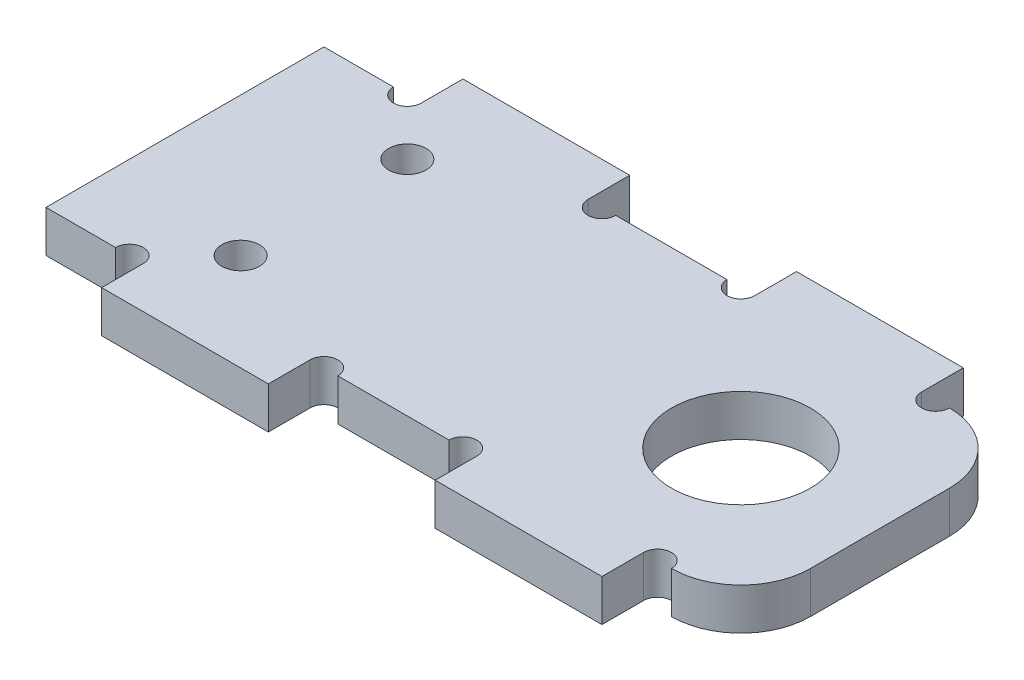
ISO-10303-21;
HEADER;
FILE_DESCRIPTION(('STEP AP214'),'2;1');
FILE_NAME('part.step','',(''),(''),'','','');
FILE_SCHEMA(('AUTOMOTIVE_DESIGN { 1 0 10303 214 1 1 1 1 }'));
ENDSEC;
DATA;
#1=APPLICATION_CONTEXT('core data for automotive mechanical design processes');
#2=APPLICATION_PROTOCOL_DEFINITION('international standard','automotive_design',2000,#1);
#3=PRODUCT_CONTEXT('',#1,'mechanical');
#4=PRODUCT('Part','Part','',(#3));
#5=PRODUCT_RELATED_PRODUCT_CATEGORY('part','',(#4));
#6=PRODUCT_DEFINITION_FORMATION('','',#4);
#7=PRODUCT_DEFINITION_CONTEXT('part definition',#1,'design');
#8=PRODUCT_DEFINITION('design','',#6,#7);
#9=PRODUCT_DEFINITION_SHAPE('','',#8);
#10=(LENGTH_UNIT() NAMED_UNIT(*) SI_UNIT(.MILLI.,.METRE.));
#11=(NAMED_UNIT(*) PLANE_ANGLE_UNIT() SI_UNIT($,.RADIAN.));
#12=(NAMED_UNIT(*) SI_UNIT($,.STERADIAN.) SOLID_ANGLE_UNIT());
#13=UNCERTAINTY_MEASURE_WITH_UNIT(LENGTH_MEASURE(1.E-05),#10,'distance_accuracy_value','');
#14=(GEOMETRIC_REPRESENTATION_CONTEXT(3) GLOBAL_UNCERTAINTY_ASSIGNED_CONTEXT((#13)) GLOBAL_UNIT_ASSIGNED_CONTEXT((#10,
#11,#12)) REPRESENTATION_CONTEXT('',''));
#15=CARTESIAN_POINT('',(0.,0.,0.));
#16=DIRECTION('',(0.,0.,1.));
#17=DIRECTION('',(1.,0.,0.));
#18=AXIS2_PLACEMENT_3D('',#15,#16,#17);
#19=CARTESIAN_POINT('',(-30.,3.,10.));
#20=DIRECTION('',(0.,0.,-1.));
#21=DIRECTION('',(1.,0.,0.));
#22=AXIS2_PLACEMENT_3D('',#19,#20,#21);
#23=PLANE('',#22);
#24=DIRECTION('',(-1.,0.,0.));
#25=VECTOR('',#24,1.);
#26=CARTESIAN_POINT('',(-10.,3.,10.));
#27=LINE('',#26,#25);
#28=CARTESIAN_POINT('',(-35.,3.,10.));
#29=VERTEX_POINT('',#28);
#30=CARTESIAN_POINT('',(-40.,3.,10.));
#31=VERTEX_POINT('',#30);
#32=EDGE_CURVE('E448',#29,#31,#27,.T.);
#33=ORIENTED_EDGE('',*,*,#32,.T.);
#34=DIRECTION('',(0.,-1.,0.));
#35=VECTOR('',#34,1.);
#36=CARTESIAN_POINT('',(-40.,3.,10.));
#37=LINE('',#36,#35);
#38=CARTESIAN_POINT('',(-40.,0.,10.));
#39=VERTEX_POINT('',#38);
#40=EDGE_CURVE('E268',#31,#39,#37,.T.);
#41=ORIENTED_EDGE('',*,*,#40,.T.);
#42=DIRECTION('',(-1.,0.,0.));
#43=VECTOR('',#42,1.);
#44=CARTESIAN_POINT('',(-30.,0.,10.));
#45=LINE('',#44,#43);
#46=CARTESIAN_POINT('',(-35.,0.,10.));
#47=VERTEX_POINT('',#46);
#48=EDGE_CURVE('E252',#47,#39,#45,.T.);
#49=ORIENTED_EDGE('',*,*,#48,.F.);
#50=DIRECTION('',(0.,-1.,0.));
#51=VECTOR('',#50,1.);
#52=CARTESIAN_POINT('',(-35.,3.,10.));
#53=LINE('',#52,#51);
#54=EDGE_CURVE('E233',#29,#47,#53,.T.);
#55=ORIENTED_EDGE('',*,*,#54,.F.);
#56=EDGE_LOOP('',(#33,#41,#49,#55));
#57=FACE_BOUND('',#56,.T.);
#58=ADVANCED_FACE('F37',(#57),#23,.F.);
#59=CARTESIAN_POINT('',(-10.,3.,-10.));
#60=DIRECTION('',(0.,0.,1.));
#61=DIRECTION('',(-1.,0.,0.));
#62=AXIS2_PLACEMENT_3D('',#59,#60,#61);
#63=PLANE('',#62);
#64=DIRECTION('',(1.,0.,0.));
#65=VECTOR('',#64,1.);
#66=CARTESIAN_POINT('',(-10.,0.,-10.));
#67=LINE('',#66,#65);
#68=CARTESIAN_POINT('',(-40.,0.,-10.));
#69=VERTEX_POINT('',#68);
#70=CARTESIAN_POINT('',(-35.,0.,-10.));
#71=VERTEX_POINT('',#70);
#72=EDGE_CURVE('E261',#69,#71,#67,.T.);
#73=ORIENTED_EDGE('',*,*,#72,.F.);
#74=DIRECTION('',(0.,-1.,0.));
#75=VECTOR('',#74,1.);
#76=CARTESIAN_POINT('',(-40.,3.,-10.));
#77=LINE('',#76,#75);
#78=CARTESIAN_POINT('',(-40.,3.,-10.));
#79=VERTEX_POINT('',#78);
#80=EDGE_CURVE('E265',#79,#69,#77,.T.);
#81=ORIENTED_EDGE('',*,*,#80,.F.);
#82=DIRECTION('',(1.,0.,0.));
#83=VECTOR('',#82,1.);
#84=CARTESIAN_POINT('',(-40.,3.,-10.));
#85=LINE('',#84,#83);
#86=CARTESIAN_POINT('',(-35.,3.,-10.));
#87=VERTEX_POINT('',#86);
#88=EDGE_CURVE('E269',#79,#87,#85,.T.);
#89=ORIENTED_EDGE('',*,*,#88,.T.);
#90=DIRECTION('',(0.,-1.,0.));
#91=VECTOR('',#90,1.);
#92=CARTESIAN_POINT('',(-35.,3.,-10.));
#93=LINE('',#92,#91);
#94=EDGE_CURVE('E330',#71,#87,#93,.F.);
#95=ORIENTED_EDGE('',*,*,#94,.F.);
#96=EDGE_LOOP('',(#73,#81,#89,#95));
#97=FACE_BOUND('',#96,.T.);
#98=ADVANCED_FACE('F536',(#97),#63,.F.);
#99=CARTESIAN_POINT('',(0.,3.,0.));
#100=DIRECTION('',(0.,-1.,0.));
#101=DIRECTION('',(0.,0.,1.));
#102=AXIS2_PLACEMENT_3D('',#99,#100,#101);
#103=PLANE('',#102);
#104=DIRECTION('',(0.,0.,1.));
#105=VECTOR('',#104,1.);
#106=CARTESIAN_POINT('',(-21.,3.,-10.));
#107=LINE('',#106,#105);
#108=CARTESIAN_POINT('',(-21.,3.,-13.));
#109=VERTEX_POINT('',#108);
#110=CARTESIAN_POINT('',(-21.,3.,-10.));
#111=VERTEX_POINT('',#110);
#112=EDGE_CURVE('E404',#109,#111,#107,.T.);
#113=ORIENTED_EDGE('',*,*,#112,.F.);
#114=DIRECTION('',(1.,0.,0.));
#115=VECTOR('',#114,1.);
#116=CARTESIAN_POINT('',(-33.,3.,-13.));
#117=LINE('',#116,#115);
#118=CARTESIAN_POINT('',(-33.,3.,-13.));
#119=VERTEX_POINT('',#118);
#120=EDGE_CURVE('E407',#119,#109,#117,.T.);
#121=ORIENTED_EDGE('',*,*,#120,.F.);
#122=DIRECTION('',(0.,0.,-1.));
#123=VECTOR('',#122,1.);
#124=CARTESIAN_POINT('',(-33.,3.,-10.));
#125=LINE('',#124,#123);
#126=CARTESIAN_POINT('',(-33.,3.,-10.));
#127=VERTEX_POINT('',#126);
#128=EDGE_CURVE('E411',#127,#119,#125,.T.);
#129=ORIENTED_EDGE('',*,*,#128,.F.);
#130=CARTESIAN_POINT('',(-34.,3.,-10.));
#131=DIRECTION('',(0.,1.,0.));
#132=DIRECTION('',(0.,0.,1.));
#133=AXIS2_PLACEMENT_3D('',#130,#131,#132);
#134=CIRCLE('',#133,0.999999999999998);
#135=EDGE_CURVE('E234',#87,#127,#134,.T.);
#136=ORIENTED_EDGE('',*,*,#135,.F.);
#137=ORIENTED_EDGE('',*,*,#88,.F.);
#138=DIRECTION('',(0.,0.,-1.));
#139=VECTOR('',#138,1.);
#140=CARTESIAN_POINT('',(-40.,3.,10.));
#141=LINE('',#140,#139);
#142=EDGE_CURVE('E451',#31,#79,#141,.T.);
#143=ORIENTED_EDGE('',*,*,#142,.F.);
#144=ORIENTED_EDGE('',*,*,#32,.F.);
#145=CARTESIAN_POINT('',(-34.,3.,10.));
#146=DIRECTION('',(0.,1.,0.));
#147=DIRECTION('',(0.,0.,-1.));
#148=AXIS2_PLACEMENT_3D('',#145,#146,#147);
#149=CIRCLE('',#148,0.999999999999998);
#150=CARTESIAN_POINT('',(-33.,3.,10.));
#151=VERTEX_POINT('',#150);
#152=EDGE_CURVE('E244',#151,#29,#149,.T.);
#153=ORIENTED_EDGE('',*,*,#152,.F.);
#154=DIRECTION('',(0.,0.,-1.));
#155=VECTOR('',#154,1.);
#156=CARTESIAN_POINT('',(-33.,3.,10.));
#157=LINE('',#156,#155);
#158=CARTESIAN_POINT('',(-33.,3.,13.));
#159=VERTEX_POINT('',#158);
#160=EDGE_CURVE('E337',#159,#151,#157,.T.);
#161=ORIENTED_EDGE('',*,*,#160,.F.);
#162=DIRECTION('',(-1.,0.,0.));
#163=VECTOR('',#162,1.);
#164=CARTESIAN_POINT('',(-33.,3.,13.));
#165=LINE('',#164,#163);
#166=CARTESIAN_POINT('',(-21.,3.,13.));
#167=VERTEX_POINT('',#166);
#168=EDGE_CURVE('E339',#167,#159,#165,.T.);
#169=ORIENTED_EDGE('',*,*,#168,.F.);
#170=DIRECTION('',(0.,0.,1.));
#171=VECTOR('',#170,1.);
#172=CARTESIAN_POINT('',(-21.,3.,10.));
#173=LINE('',#172,#171);
#174=CARTESIAN_POINT('',(-21.,3.,10.));
#175=VERTEX_POINT('',#174);
#176=EDGE_CURVE('E334',#175,#167,#173,.T.);
#177=ORIENTED_EDGE('',*,*,#176,.F.);
#178=CARTESIAN_POINT('',(-20.,3.,10.));
#179=DIRECTION('',(0.,1.,0.));
#180=DIRECTION('',(0.,0.,1.));
#181=AXIS2_PLACEMENT_3D('',#178,#179,#180);
#182=CIRCLE('',#181,1.00000000000001);
#183=CARTESIAN_POINT('',(-19.,3.,10.));
#184=VERTEX_POINT('',#183);
#185=EDGE_CURVE('E243',#184,#175,#182,.T.);
#186=ORIENTED_EDGE('',*,*,#185,.F.);
#187=CARTESIAN_POINT('',(-11.,3.,10.));
#188=VERTEX_POINT('',#187);
#189=EDGE_CURVE('E229',#188,#184,#27,.T.);
#190=ORIENTED_EDGE('',*,*,#189,.F.);
#191=CARTESIAN_POINT('',(-10.,3.,10.));
#192=DIRECTION('',(0.,1.,0.));
#193=DIRECTION('',(0.,0.,-1.));
#194=AXIS2_PLACEMENT_3D('',#191,#192,#193);
#195=CIRCLE('',#194,1.00000000000001);
#196=CARTESIAN_POINT('',(-9.,3.,10.));
#197=VERTEX_POINT('',#196);
#198=EDGE_CURVE('E312',#197,#188,#195,.T.);
#199=ORIENTED_EDGE('',*,*,#198,.F.);
#200=DIRECTION('',(0.,0.,-1.));
#201=VECTOR('',#200,1.);
#202=CARTESIAN_POINT('',(-9.,3.,10.));
#203=LINE('',#202,#201);
#204=CARTESIAN_POINT('',(-9.,3.,13.));
#205=VERTEX_POINT('',#204);
#206=EDGE_CURVE('E361',#205,#197,#203,.T.);
#207=ORIENTED_EDGE('',*,*,#206,.F.);
#208=DIRECTION('',(-1.,0.,0.));
#209=VECTOR('',#208,1.);
#210=CARTESIAN_POINT('',(3.,3.,13.));
#211=LINE('',#210,#209);
#212=CARTESIAN_POINT('',(3.,3.,13.));
#213=VERTEX_POINT('',#212);
#214=EDGE_CURVE('E356',#213,#205,#211,.T.);
#215=ORIENTED_EDGE('',*,*,#214,.F.);
#216=DIRECTION('',(0.,0.,1.));
#217=VECTOR('',#216,1.);
#218=CARTESIAN_POINT('',(3.,3.,10.));
#219=LINE('',#218,#217);
#220=CARTESIAN_POINT('',(3.,3.,10.));
#221=VERTEX_POINT('',#220);
#222=EDGE_CURVE('E303',#221,#213,#219,.T.);
#223=ORIENTED_EDGE('',*,*,#222,.F.);
#224=CARTESIAN_POINT('',(4.,3.,10.));
#225=DIRECTION('',(0.,1.,0.));
#226=DIRECTION('',(0.,0.,1.));
#227=AXIS2_PLACEMENT_3D('',#224,#225,#226);
#228=CIRCLE('',#227,1.);
#229=CARTESIAN_POINT('',(5.,3.,10.));
#230=VERTEX_POINT('',#229);
#231=EDGE_CURVE('E297',#230,#221,#228,.T.);
#232=ORIENTED_EDGE('',*,*,#231,.F.);
#233=CARTESIAN_POINT('',(5.,3.,5.));
#234=DIRECTION('',(0.,1.,0.));
#235=DIRECTION('',(0.,0.,1.));
#236=AXIS2_PLACEMENT_3D('',#233,#234,#235);
#237=CIRCLE('',#236,5.);
#238=CARTESIAN_POINT('',(10.,3.,5.));
#239=VERTEX_POINT('',#238);
#240=EDGE_CURVE('E45',#239,#230,#237,.F.);
#241=ORIENTED_EDGE('',*,*,#240,.F.);
#242=DIRECTION('',(0.,0.,1.));
#243=VECTOR('',#242,1.);
#244=CARTESIAN_POINT('',(10.,3.,-10.));
#245=LINE('',#244,#243);
#246=CARTESIAN_POINT('',(10.,3.,-5.));
#247=VERTEX_POINT('',#246);
#248=EDGE_CURVE('E264',#247,#239,#245,.T.);
#249=ORIENTED_EDGE('',*,*,#248,.F.);
#250=CARTESIAN_POINT('',(5.,3.,-5.));
#251=DIRECTION('',(0.,1.,0.));
#252=DIRECTION('',(0.,0.,1.));
#253=AXIS2_PLACEMENT_3D('',#250,#251,#252);
#254=CIRCLE('',#253,5.);
#255=CARTESIAN_POINT('',(4.99999999999999,3.,-10.));
#256=VERTEX_POINT('',#255);
#257=EDGE_CURVE('E284',#256,#247,#254,.F.);
#258=ORIENTED_EDGE('',*,*,#257,.F.);
#259=CARTESIAN_POINT('',(3.99999999999999,3.,-10.));
#260=DIRECTION('',(0.,1.,0.));
#261=DIRECTION('',(0.,0.,-1.));
#262=AXIS2_PLACEMENT_3D('',#259,#260,#261);
#263=CIRCLE('',#262,1.);
#264=CARTESIAN_POINT('',(3.,3.,-10.));
#265=VERTEX_POINT('',#264);
#266=EDGE_CURVE('E309',#265,#256,#263,.T.);
#267=ORIENTED_EDGE('',*,*,#266,.F.);
#268=DIRECTION('',(0.,0.,1.));
#269=VECTOR('',#268,1.);
#270=CARTESIAN_POINT('',(3.,3.,-10.));
#271=LINE('',#270,#269);
#272=CARTESIAN_POINT('',(3.,3.,-13.));
#273=VERTEX_POINT('',#272);
#274=EDGE_CURVE('E381',#273,#265,#271,.T.);
#275=ORIENTED_EDGE('',*,*,#274,.F.);
#276=DIRECTION('',(1.,0.,0.));
#277=VECTOR('',#276,1.);
#278=CARTESIAN_POINT('',(3.,3.,-13.));
#279=LINE('',#278,#277);
#280=CARTESIAN_POINT('',(-9.,3.,-13.));
#281=VERTEX_POINT('',#280);
#282=EDGE_CURVE('E385',#281,#273,#279,.T.);
#283=ORIENTED_EDGE('',*,*,#282,.F.);
#284=DIRECTION('',(0.,0.,-1.));
#285=VECTOR('',#284,1.);
#286=CARTESIAN_POINT('',(-9.,3.,-10.));
#287=LINE('',#286,#285);
#288=CARTESIAN_POINT('',(-9.,3.,-10.));
#289=VERTEX_POINT('',#288);
#290=EDGE_CURVE('E378',#289,#281,#287,.T.);
#291=ORIENTED_EDGE('',*,*,#290,.F.);
#292=CARTESIAN_POINT('',(-10.,3.,-10.));
#293=DIRECTION('',(0.,1.,0.));
#294=DIRECTION('',(0.,0.,1.));
#295=AXIS2_PLACEMENT_3D('',#292,#293,#294);
#296=CIRCLE('',#295,1.);
#297=CARTESIAN_POINT('',(-11.,3.,-10.));
#298=VERTEX_POINT('',#297);
#299=EDGE_CURVE('E469',#298,#289,#296,.T.);
#300=ORIENTED_EDGE('',*,*,#299,.F.);
#301=CARTESIAN_POINT('',(-19.,3.,-10.));
#302=VERTEX_POINT('',#301);
#303=EDGE_CURVE('E452',#302,#298,#85,.T.);
#304=ORIENTED_EDGE('',*,*,#303,.F.);
#305=CARTESIAN_POINT('',(-20.,3.,-10.));
#306=DIRECTION('',(0.,1.,0.));
#307=DIRECTION('',(0.,0.,-1.));
#308=AXIS2_PLACEMENT_3D('',#305,#306,#307);
#309=CIRCLE('',#308,1.);
#310=EDGE_CURVE('E320',#111,#302,#309,.T.);
#311=ORIENTED_EDGE('',*,*,#310,.F.);
#312=EDGE_LOOP('',(#113,#121,#129,#136,#137,#143,#144,#153,#161,#169,#177,#186,#190,#199,#207,
#215,#223,#232,#241,#249,#258,#267,#275,#283,#291,#300,#304,#311));
#313=FACE_BOUND('',#312,.T.);
#314=CARTESIAN_POINT('',(0.,3.,0.));
#315=DIRECTION('',(0.,-1.,0.));
#316=DIRECTION('',(0.,0.,-1.));
#317=AXIS2_PLACEMENT_3D('',#314,#315,#316);
#318=CIRCLE('',#317,5.);
#319=CARTESIAN_POINT('',(0.,3.,-5.));
#320=VERTEX_POINT('',#319);
#321=EDGE_CURVE('E442',#320,#320,#318,.T.);
#322=ORIENTED_EDGE('',*,*,#321,.T.);
#323=EDGE_LOOP('',(#322));
#324=FACE_BOUND('',#323,.T.);
#325=CARTESIAN_POINT('',(-30.,3.,6.));
#326=DIRECTION('',(0.,-1.,0.));
#327=DIRECTION('',(0.,0.,1.));
#328=AXIS2_PLACEMENT_3D('',#325,#326,#327);
#329=CIRCLE('',#328,1.35);
#330=CARTESIAN_POINT('',(-30.,3.,7.35));
#331=VERTEX_POINT('',#330);
#332=EDGE_CURVE('E436',#331,#331,#329,.T.);
#333=ORIENTED_EDGE('',*,*,#332,.T.);
#334=EDGE_LOOP('',(#333));
#335=FACE_BOUND('',#334,.T.);
#336=CARTESIAN_POINT('',(-30.,3.,-6.));
#337=DIRECTION('',(0.,-1.,0.));
#338=DIRECTION('',(0.,0.,-1.));
#339=AXIS2_PLACEMENT_3D('',#336,#337,#338);
#340=CIRCLE('',#339,1.35);
#341=CARTESIAN_POINT('',(-30.,3.,-7.35));
#342=VERTEX_POINT('',#341);
#343=EDGE_CURVE('E430',#342,#342,#340,.T.);
#344=ORIENTED_EDGE('',*,*,#343,.T.);
#345=EDGE_LOOP('',(#344));
#346=FACE_BOUND('',#345,.T.);
#347=ADVANCED_FACE('F299',(#313,#324,#335,#346),#103,.F.);
#348=CARTESIAN_POINT('',(0.,0.,0.));
#349=DIRECTION('',(0.,-1.,0.));
#350=DIRECTION('',(0.,0.,1.));
#351=AXIS2_PLACEMENT_3D('',#348,#349,#350);
#352=PLANE('',#351);
#353=CARTESIAN_POINT('',(-20.,0.,-10.));
#354=DIRECTION('',(0.,1.,0.));
#355=DIRECTION('',(0.,0.,-1.));
#356=AXIS2_PLACEMENT_3D('',#353,#354,#355);
#357=CIRCLE('',#356,1.);
#358=CARTESIAN_POINT('',(-21.,0.,-10.));
#359=VERTEX_POINT('',#358);
#360=CARTESIAN_POINT('',(-19.,0.,-10.));
#361=VERTEX_POINT('',#360);
#362=EDGE_CURVE('E472',#359,#361,#357,.T.);
#363=ORIENTED_EDGE('',*,*,#362,.T.);
#364=CARTESIAN_POINT('',(-11.,0.,-10.));
#365=VERTEX_POINT('',#364);
#366=EDGE_CURVE('E254',#361,#365,#67,.T.);
#367=ORIENTED_EDGE('',*,*,#366,.T.);
#368=CARTESIAN_POINT('',(-10.,0.,-10.));
#369=DIRECTION('',(0.,1.,0.));
#370=DIRECTION('',(0.,0.,1.));
#371=AXIS2_PLACEMENT_3D('',#368,#369,#370);
#372=CIRCLE('',#371,1.);
#373=CARTESIAN_POINT('',(-9.,0.,-10.));
#374=VERTEX_POINT('',#373);
#375=EDGE_CURVE('E473',#365,#374,#372,.T.);
#376=ORIENTED_EDGE('',*,*,#375,.T.);
#377=DIRECTION('',(0.,0.,1.));
#378=VECTOR('',#377,1.);
#379=CARTESIAN_POINT('',(-9.,0.,-10.));
#380=LINE('',#379,#378);
#381=CARTESIAN_POINT('',(-9.,0.,-13.));
#382=VERTEX_POINT('',#381);
#383=EDGE_CURVE('E391',#382,#374,#380,.T.);
#384=ORIENTED_EDGE('',*,*,#383,.F.);
#385=DIRECTION('',(-1.,0.,0.));
#386=VECTOR('',#385,1.);
#387=CARTESIAN_POINT('',(3.,0.,-13.));
#388=LINE('',#387,#386);
#389=CARTESIAN_POINT('',(3.,0.,-13.));
#390=VERTEX_POINT('',#389);
#391=EDGE_CURVE('E388',#390,#382,#388,.T.);
#392=ORIENTED_EDGE('',*,*,#391,.F.);
#393=DIRECTION('',(0.,0.,-1.));
#394=VECTOR('',#393,1.);
#395=CARTESIAN_POINT('',(3.,0.,-10.));
#396=LINE('',#395,#394);
#397=CARTESIAN_POINT('',(3.,0.,-10.));
#398=VERTEX_POINT('',#397);
#399=EDGE_CURVE('E377',#398,#390,#396,.T.);
#400=ORIENTED_EDGE('',*,*,#399,.F.);
#401=CARTESIAN_POINT('',(3.99999999999999,0.,-10.));
#402=DIRECTION('',(0.,1.,0.));
#403=DIRECTION('',(0.,0.,-1.));
#404=AXIS2_PLACEMENT_3D('',#401,#402,#403);
#405=CIRCLE('',#404,1.);
#406=CARTESIAN_POINT('',(4.99999999999999,0.,-10.));
#407=VERTEX_POINT('',#406);
#408=EDGE_CURVE('E305',#398,#407,#405,.T.);
#409=ORIENTED_EDGE('',*,*,#408,.T.);
#410=CARTESIAN_POINT('',(5.,0.,-5.));
#411=DIRECTION('',(0.,1.,0.));
#412=DIRECTION('',(0.,0.,1.));
#413=AXIS2_PLACEMENT_3D('',#410,#411,#412);
#414=CIRCLE('',#413,5.);
#415=CARTESIAN_POINT('',(10.,0.,-5.));
#416=VERTEX_POINT('',#415);
#417=EDGE_CURVE('E274',#416,#407,#414,.T.);
#418=ORIENTED_EDGE('',*,*,#417,.F.);
#419=DIRECTION('',(0.,0.,1.));
#420=VECTOR('',#419,1.);
#421=CARTESIAN_POINT('',(10.,0.,-10.));
#422=LINE('',#421,#420);
#423=CARTESIAN_POINT('',(10.,0.,5.));
#424=VERTEX_POINT('',#423);
#425=EDGE_CURVE('E257',#416,#424,#422,.T.);
#426=ORIENTED_EDGE('',*,*,#425,.T.);
#427=CARTESIAN_POINT('',(5.,0.,5.));
#428=DIRECTION('',(0.,1.,0.));
#429=DIRECTION('',(0.,0.,1.));
#430=AXIS2_PLACEMENT_3D('',#427,#428,#429);
#431=CIRCLE('',#430,5.);
#432=CARTESIAN_POINT('',(5.,0.,10.));
#433=VERTEX_POINT('',#432);
#434=EDGE_CURVE('E277',#433,#424,#431,.T.);
#435=ORIENTED_EDGE('',*,*,#434,.F.);
#436=CARTESIAN_POINT('',(4.,0.,10.));
#437=DIRECTION('',(0.,1.,0.));
#438=DIRECTION('',(0.,0.,1.));
#439=AXIS2_PLACEMENT_3D('',#436,#437,#438);
#440=CIRCLE('',#439,1.);
#441=CARTESIAN_POINT('',(3.,0.,10.));
#442=VERTEX_POINT('',#441);
#443=EDGE_CURVE('E306',#433,#442,#440,.T.);
#444=ORIENTED_EDGE('',*,*,#443,.T.);
#445=DIRECTION('',(0.,0.,-1.));
#446=VECTOR('',#445,1.);
#447=CARTESIAN_POINT('',(3.,0.,10.));
#448=LINE('',#447,#446);
#449=CARTESIAN_POINT('',(3.,0.,13.));
#450=VERTEX_POINT('',#449);
#451=EDGE_CURVE('E367',#450,#442,#448,.T.);
#452=ORIENTED_EDGE('',*,*,#451,.F.);
#453=DIRECTION('',(1.,0.,0.));
#454=VECTOR('',#453,1.);
#455=CARTESIAN_POINT('',(3.,0.,13.));
#456=LINE('',#455,#454);
#457=CARTESIAN_POINT('',(-9.,0.,13.));
#458=VERTEX_POINT('',#457);
#459=EDGE_CURVE('E364',#458,#450,#456,.T.);
#460=ORIENTED_EDGE('',*,*,#459,.F.);
#461=DIRECTION('',(0.,0.,1.));
#462=VECTOR('',#461,1.);
#463=CARTESIAN_POINT('',(-9.,0.,10.));
#464=LINE('',#463,#462);
#465=CARTESIAN_POINT('',(-9.,0.,10.));
#466=VERTEX_POINT('',#465);
#467=EDGE_CURVE('E355',#466,#458,#464,.T.);
#468=ORIENTED_EDGE('',*,*,#467,.F.);
#469=CARTESIAN_POINT('',(-10.,0.,10.));
#470=DIRECTION('',(0.,1.,0.));
#471=DIRECTION('',(0.,0.,-1.));
#472=AXIS2_PLACEMENT_3D('',#469,#470,#471);
#473=CIRCLE('',#472,1.00000000000001);
#474=CARTESIAN_POINT('',(-11.,0.,10.));
#475=VERTEX_POINT('',#474);
#476=EDGE_CURVE('E250',#466,#475,#473,.T.);
#477=ORIENTED_EDGE('',*,*,#476,.T.);
#478=CARTESIAN_POINT('',(-19.,0.,10.));
#479=VERTEX_POINT('',#478);
#480=EDGE_CURVE('E226',#475,#479,#45,.T.);
#481=ORIENTED_EDGE('',*,*,#480,.T.);
#482=CARTESIAN_POINT('',(-20.,0.,10.));
#483=DIRECTION('',(0.,1.,0.));
#484=DIRECTION('',(0.,0.,1.));
#485=AXIS2_PLACEMENT_3D('',#482,#483,#484);
#486=CIRCLE('',#485,1.00000000000001);
#487=CARTESIAN_POINT('',(-21.,0.,10.));
#488=VERTEX_POINT('',#487);
#489=EDGE_CURVE('E237',#479,#488,#486,.T.);
#490=ORIENTED_EDGE('',*,*,#489,.T.);
#491=DIRECTION('',(0.,0.,-1.));
#492=VECTOR('',#491,1.);
#493=CARTESIAN_POINT('',(-21.,0.,10.));
#494=LINE('',#493,#492);
#495=CARTESIAN_POINT('',(-21.,0.,13.));
#496=VERTEX_POINT('',#495);
#497=EDGE_CURVE('E345',#496,#488,#494,.T.);
#498=ORIENTED_EDGE('',*,*,#497,.F.);
#499=DIRECTION('',(1.,0.,0.));
#500=VECTOR('',#499,1.);
#501=CARTESIAN_POINT('',(-33.,0.,13.));
#502=LINE('',#501,#500);
#503=CARTESIAN_POINT('',(-33.,0.,13.));
#504=VERTEX_POINT('',#503);
#505=EDGE_CURVE('E342',#504,#496,#502,.T.);
#506=ORIENTED_EDGE('',*,*,#505,.F.);
#507=DIRECTION('',(0.,0.,1.));
#508=VECTOR('',#507,1.);
#509=CARTESIAN_POINT('',(-33.,0.,10.));
#510=LINE('',#509,#508);
#511=CARTESIAN_POINT('',(-33.,0.,10.));
#512=VERTEX_POINT('',#511);
#513=EDGE_CURVE('E333',#512,#504,#510,.T.);
#514=ORIENTED_EDGE('',*,*,#513,.F.);
#515=CARTESIAN_POINT('',(-34.,0.,10.));
#516=DIRECTION('',(0.,1.,0.));
#517=DIRECTION('',(0.,0.,-1.));
#518=AXIS2_PLACEMENT_3D('',#515,#516,#517);
#519=CIRCLE('',#518,0.999999999999998);
#520=EDGE_CURVE('E507',#512,#47,#519,.T.);
#521=ORIENTED_EDGE('',*,*,#520,.T.);
#522=ORIENTED_EDGE('',*,*,#48,.T.);
#523=DIRECTION('',(0.,0.,-1.));
#524=VECTOR('',#523,1.);
#525=CARTESIAN_POINT('',(-40.,0.,10.));
#526=LINE('',#525,#524);
#527=EDGE_CURVE('E251',#39,#69,#526,.T.);
#528=ORIENTED_EDGE('',*,*,#527,.T.);
#529=ORIENTED_EDGE('',*,*,#72,.T.);
#530=CARTESIAN_POINT('',(-34.,0.,-10.));
#531=DIRECTION('',(0.,1.,0.));
#532=DIRECTION('',(0.,0.,1.));
#533=AXIS2_PLACEMENT_3D('',#530,#531,#532);
#534=CIRCLE('',#533,0.999999999999998);
#535=CARTESIAN_POINT('',(-33.,0.,-10.));
#536=VERTEX_POINT('',#535);
#537=EDGE_CURVE('E318',#71,#536,#534,.T.);
#538=ORIENTED_EDGE('',*,*,#537,.T.);
#539=DIRECTION('',(0.,0.,1.));
#540=VECTOR('',#539,1.);
#541=CARTESIAN_POINT('',(-33.,0.,-10.));
#542=LINE('',#541,#540);
#543=CARTESIAN_POINT('',(-33.,0.,-13.));
#544=VERTEX_POINT('',#543);
#545=EDGE_CURVE('E403',#544,#536,#542,.T.);
#546=ORIENTED_EDGE('',*,*,#545,.F.);
#547=DIRECTION('',(-1.,0.,0.));
#548=VECTOR('',#547,1.);
#549=CARTESIAN_POINT('',(-33.,0.,-13.));
#550=LINE('',#549,#548);
#551=CARTESIAN_POINT('',(-21.,0.,-13.));
#552=VERTEX_POINT('',#551);
#553=EDGE_CURVE('E420',#552,#544,#550,.T.);
#554=ORIENTED_EDGE('',*,*,#553,.F.);
#555=DIRECTION('',(0.,0.,-1.));
#556=VECTOR('',#555,1.);
#557=CARTESIAN_POINT('',(-21.,0.,-10.));
#558=LINE('',#557,#556);
#559=EDGE_CURVE('E417',#359,#552,#558,.T.);
#560=ORIENTED_EDGE('',*,*,#559,.F.);
#561=EDGE_LOOP('',(#363,#367,#376,#384,#392,#400,#409,#418,#426,#435,#444,#452,#460,#468,#477,
#481,#490,#498,#506,#514,#521,#522,#528,#529,#538,#546,#554,#560));
#562=FACE_BOUND('',#561,.T.);
#563=CARTESIAN_POINT('',(-30.,0.,6.));
#564=DIRECTION('',(0.,-1.,0.));
#565=DIRECTION('',(0.,0.,1.));
#566=AXIS2_PLACEMENT_3D('',#563,#564,#565);
#567=CIRCLE('',#566,1.35);
#568=CARTESIAN_POINT('',(-30.,0.,7.35));
#569=VERTEX_POINT('',#568);
#570=EDGE_CURVE('E433',#569,#569,#567,.T.);
#571=ORIENTED_EDGE('',*,*,#570,.F.);
#572=EDGE_LOOP('',(#571));
#573=FACE_BOUND('',#572,.T.);
#574=CARTESIAN_POINT('',(0.,0.,0.));
#575=DIRECTION('',(0.,-1.,0.));
#576=DIRECTION('',(0.,0.,-1.));
#577=AXIS2_PLACEMENT_3D('',#574,#575,#576);
#578=CIRCLE('',#577,5.);
#579=CARTESIAN_POINT('',(0.,0.,-5.));
#580=VERTEX_POINT('',#579);
#581=EDGE_CURVE('E439',#580,#580,#578,.T.);
#582=ORIENTED_EDGE('',*,*,#581,.F.);
#583=EDGE_LOOP('',(#582));
#584=FACE_BOUND('',#583,.T.);
#585=CARTESIAN_POINT('',(-30.,0.,-6.));
#586=DIRECTION('',(0.,-1.,0.));
#587=DIRECTION('',(0.,0.,-1.));
#588=AXIS2_PLACEMENT_3D('',#585,#586,#587);
#589=CIRCLE('',#588,1.35);
#590=CARTESIAN_POINT('',(-30.,0.,-7.35));
#591=VERTEX_POINT('',#590);
#592=EDGE_CURVE('E414',#591,#591,#589,.T.);
#593=ORIENTED_EDGE('',*,*,#592,.F.);
#594=EDGE_LOOP('',(#593));
#595=FACE_BOUND('',#594,.T.);
#596=ADVANCED_FACE('F247',(#562,#573,#584,#595),#352,.T.);
#597=CARTESIAN_POINT('',(10.,3.,-10.));
#598=DIRECTION('',(-1.,0.,0.));
#599=DIRECTION('',(0.,0.,-1.));
#600=AXIS2_PLACEMENT_3D('',#597,#598,#599);
#601=PLANE('',#600);
#602=ORIENTED_EDGE('',*,*,#425,.F.);
#603=DIRECTION('',(0.,-1.,0.));
#604=VECTOR('',#603,1.);
#605=CARTESIAN_POINT('',(10.,3.,-5.));
#606=LINE('',#605,#604);
#607=EDGE_CURVE('E280',#247,#416,#606,.T.);
#608=ORIENTED_EDGE('',*,*,#607,.F.);
#609=ORIENTED_EDGE('',*,*,#248,.T.);
#610=DIRECTION('',(0.,-1.,0.));
#611=VECTOR('',#610,1.);
#612=CARTESIAN_POINT('',(10.,3.,5.));
#613=LINE('',#612,#611);
#614=EDGE_CURVE('E282',#424,#239,#613,.F.);
#615=ORIENTED_EDGE('',*,*,#614,.F.);
#616=EDGE_LOOP('',(#602,#608,#609,#615));
#617=FACE_BOUND('',#616,.T.);
#618=ADVANCED_FACE('F566',(#617),#601,.F.);
#619=ORIENTED_EDGE('',*,*,#189,.T.);
#620=DIRECTION('',(0.,-1.,0.));
#621=VECTOR('',#620,1.);
#622=CARTESIAN_POINT('',(-19.,3.,10.));
#623=LINE('',#622,#621);
#624=EDGE_CURVE('E222',#479,#184,#623,.F.);
#625=ORIENTED_EDGE('',*,*,#624,.F.);
#626=ORIENTED_EDGE('',*,*,#480,.F.);
#627=DIRECTION('',(0.,-1.,0.));
#628=VECTOR('',#627,1.);
#629=CARTESIAN_POINT('',(-11.,3.,10.));
#630=LINE('',#629,#628);
#631=EDGE_CURVE('E324',#188,#475,#630,.T.);
#632=ORIENTED_EDGE('',*,*,#631,.F.);
#633=EDGE_LOOP('',(#619,#625,#626,#632));
#634=FACE_BOUND('',#633,.T.);
#635=ADVANCED_FACE('F224',(#634),#23,.F.);
#636=CARTESIAN_POINT('',(-40.,3.,10.));
#637=DIRECTION('',(1.,0.,0.));
#638=DIRECTION('',(0.,0.,1.));
#639=AXIS2_PLACEMENT_3D('',#636,#637,#638);
#640=PLANE('',#639);
#641=ORIENTED_EDGE('',*,*,#527,.F.);
#642=ORIENTED_EDGE('',*,*,#40,.F.);
#643=ORIENTED_EDGE('',*,*,#142,.T.);
#644=ORIENTED_EDGE('',*,*,#80,.T.);
#645=EDGE_LOOP('',(#641,#642,#643,#644));
#646=FACE_BOUND('',#645,.T.);
#647=ADVANCED_FACE('F534',(#646),#640,.F.);
#648=ORIENTED_EDGE('',*,*,#303,.T.);
#649=DIRECTION('',(0.,-1.,0.));
#650=VECTOR('',#649,1.);
#651=CARTESIAN_POINT('',(-11.,3.,-10.));
#652=LINE('',#651,#650);
#653=EDGE_CURVE('E326',#365,#298,#652,.F.);
#654=ORIENTED_EDGE('',*,*,#653,.F.);
#655=ORIENTED_EDGE('',*,*,#366,.F.);
#656=DIRECTION('',(0.,-1.,0.));
#657=VECTOR('',#656,1.);
#658=CARTESIAN_POINT('',(-19.,3.,-10.));
#659=LINE('',#658,#657);
#660=EDGE_CURVE('E328',#302,#361,#659,.T.);
#661=ORIENTED_EDGE('',*,*,#660,.F.);
#662=EDGE_LOOP('',(#648,#654,#655,#661));
#663=FACE_BOUND('',#662,.T.);
#664=ADVANCED_FACE('F462',(#663),#63,.F.);
#665=CARTESIAN_POINT('',(0.,3.,0.));
#666=DIRECTION('',(0.,-1.,0.));
#667=DIRECTION('',(0.,0.,1.));
#668=AXIS2_PLACEMENT_3D('',#665,#666,#667);
#669=CYLINDRICAL_SURFACE('',#668,5.);
#670=ORIENTED_EDGE('',*,*,#321,.F.);
#671=EDGE_LOOP('',(#670));
#672=FACE_BOUND('',#671,.T.);
#673=ORIENTED_EDGE('',*,*,#581,.T.);
#674=EDGE_LOOP('',(#673));
#675=FACE_BOUND('',#674,.T.);
#676=ADVANCED_FACE('F588',(#672,#675),#669,.F.);
#677=CARTESIAN_POINT('',(-30.,3.,6.));
#678=DIRECTION('',(0.,-1.,0.));
#679=DIRECTION('',(0.,0.,1.));
#680=AXIS2_PLACEMENT_3D('',#677,#678,#679);
#681=CYLINDRICAL_SURFACE('',#680,1.35);
#682=ORIENTED_EDGE('',*,*,#332,.F.);
#683=EDGE_LOOP('',(#682));
#684=FACE_BOUND('',#683,.T.);
#685=ORIENTED_EDGE('',*,*,#570,.T.);
#686=EDGE_LOOP('',(#685));
#687=FACE_BOUND('',#686,.T.);
#688=ADVANCED_FACE('F582',(#684,#687),#681,.F.);
#689=CARTESIAN_POINT('',(-30.,3.,-6.));
#690=DIRECTION('',(0.,-1.,0.));
#691=DIRECTION('',(0.,0.,1.));
#692=AXIS2_PLACEMENT_3D('',#689,#690,#691);
#693=CYLINDRICAL_SURFACE('',#692,1.35);
#694=ORIENTED_EDGE('',*,*,#343,.F.);
#695=EDGE_LOOP('',(#694));
#696=FACE_BOUND('',#695,.T.);
#697=ORIENTED_EDGE('',*,*,#592,.T.);
#698=EDGE_LOOP('',(#697));
#699=FACE_BOUND('',#698,.T.);
#700=ADVANCED_FACE('F577',(#696,#699),#693,.F.);
#701=CARTESIAN_POINT('',(5.,3.,5.));
#702=DIRECTION('',(0.,-1.,0.));
#703=DIRECTION('',(0.,0.,1.));
#704=AXIS2_PLACEMENT_3D('',#701,#702,#703);
#705=CYLINDRICAL_SURFACE('',#704,5.);
#706=ORIENTED_EDGE('',*,*,#240,.T.);
#707=DIRECTION('',(0.,-1.,0.));
#708=VECTOR('',#707,1.);
#709=CARTESIAN_POINT('',(5.,3.,10.));
#710=LINE('',#709,#708);
#711=EDGE_CURVE('E272',#230,#433,#710,.T.);
#712=ORIENTED_EDGE('',*,*,#711,.T.);
#713=ORIENTED_EDGE('',*,*,#434,.T.);
#714=ORIENTED_EDGE('',*,*,#614,.T.);
#715=EDGE_LOOP('',(#706,#712,#713,#714));
#716=FACE_BOUND('',#715,.T.);
#717=ADVANCED_FACE('F290',(#716),#705,.T.);
#718=CARTESIAN_POINT('',(5.,3.,-5.));
#719=DIRECTION('',(0.,-1.,0.));
#720=DIRECTION('',(0.,0.,1.));
#721=AXIS2_PLACEMENT_3D('',#718,#719,#720);
#722=CYLINDRICAL_SURFACE('',#721,5.);
#723=ORIENTED_EDGE('',*,*,#257,.T.);
#724=ORIENTED_EDGE('',*,*,#607,.T.);
#725=ORIENTED_EDGE('',*,*,#417,.T.);
#726=DIRECTION('',(0.,-1.,0.));
#727=VECTOR('',#726,1.);
#728=CARTESIAN_POINT('',(5.,3.,-10.));
#729=LINE('',#728,#727);
#730=EDGE_CURVE('E11',#407,#256,#729,.F.);
#731=ORIENTED_EDGE('',*,*,#730,.T.);
#732=EDGE_LOOP('',(#723,#724,#725,#731));
#733=FACE_BOUND('',#732,.T.);
#734=ADVANCED_FACE('F39',(#733),#722,.T.);
#735=CARTESIAN_POINT('',(-33.,15.369316876853,-10.));
#736=DIRECTION('',(-1.,0.,0.));
#737=DIRECTION('',(0.,0.,-1.));
#738=AXIS2_PLACEMENT_3D('',#735,#736,#737);
#739=PLANE('',#738);
#740=ORIENTED_EDGE('',*,*,#128,.T.);
#741=DIRECTION('',(0.,-1.,0.));
#742=VECTOR('',#741,1.);
#743=CARTESIAN_POINT('',(-33.,15.369316876853,-13.));
#744=LINE('',#743,#742);
#745=EDGE_CURVE('E408',#119,#544,#744,.T.);
#746=ORIENTED_EDGE('',*,*,#745,.T.);
#747=ORIENTED_EDGE('',*,*,#545,.T.);
#748=DIRECTION('',(0.,-1.,0.));
#749=VECTOR('',#748,1.);
#750=CARTESIAN_POINT('',(-33.,15.369316876853,-10.));
#751=LINE('',#750,#749);
#752=EDGE_CURVE('E423',#127,#536,#751,.T.);
#753=ORIENTED_EDGE('',*,*,#752,.F.);
#754=EDGE_LOOP('',(#740,#746,#747,#753));
#755=FACE_BOUND('',#754,.T.);
#756=ADVANCED_FACE('F542',(#755),#739,.T.);
#757=CARTESIAN_POINT('',(-33.,15.369316876853,-13.));
#758=DIRECTION('',(0.,0.,-1.));
#759=DIRECTION('',(1.,0.,0.));
#760=AXIS2_PLACEMENT_3D('',#757,#758,#759);
#761=PLANE('',#760);
#762=ORIENTED_EDGE('',*,*,#120,.T.);
#763=DIRECTION('',(0.,-1.,0.));
#764=VECTOR('',#763,1.);
#765=CARTESIAN_POINT('',(-21.,15.369316876853,-13.));
#766=LINE('',#765,#764);
#767=EDGE_CURVE('E425',#109,#552,#766,.T.);
#768=ORIENTED_EDGE('',*,*,#767,.T.);
#769=ORIENTED_EDGE('',*,*,#553,.T.);
#770=ORIENTED_EDGE('',*,*,#745,.F.);
#771=EDGE_LOOP('',(#762,#768,#769,#770));
#772=FACE_BOUND('',#771,.T.);
#773=ADVANCED_FACE('F545',(#772),#761,.T.);
#774=CARTESIAN_POINT('',(-21.,15.369316876853,-10.));
#775=DIRECTION('',(1.,0.,0.));
#776=DIRECTION('',(0.,0.,1.));
#777=AXIS2_PLACEMENT_3D('',#774,#775,#776);
#778=PLANE('',#777);
#779=ORIENTED_EDGE('',*,*,#112,.T.);
#780=DIRECTION('',(0.,-1.,0.));
#781=VECTOR('',#780,1.);
#782=CARTESIAN_POINT('',(-21.,15.369316876853,-10.));
#783=LINE('',#782,#781);
#784=EDGE_CURVE('E427',#111,#359,#783,.T.);
#785=ORIENTED_EDGE('',*,*,#784,.T.);
#786=ORIENTED_EDGE('',*,*,#559,.T.);
#787=ORIENTED_EDGE('',*,*,#767,.F.);
#788=EDGE_LOOP('',(#779,#785,#786,#787));
#789=FACE_BOUND('',#788,.T.);
#790=ADVANCED_FACE('F547',(#789),#778,.T.);
#791=CARTESIAN_POINT('',(3.,15.369316876853,-10.));
#792=DIRECTION('',(1.,0.,0.));
#793=DIRECTION('',(0.,0.,1.));
#794=AXIS2_PLACEMENT_3D('',#791,#792,#793);
#795=PLANE('',#794);
#796=ORIENTED_EDGE('',*,*,#274,.T.);
#797=DIRECTION('',(0.,-1.,0.));
#798=VECTOR('',#797,1.);
#799=CARTESIAN_POINT('',(3.,15.369316876853,-10.));
#800=LINE('',#799,#798);
#801=EDGE_CURVE('E382',#265,#398,#800,.T.);
#802=ORIENTED_EDGE('',*,*,#801,.T.);
#803=ORIENTED_EDGE('',*,*,#399,.T.);
#804=DIRECTION('',(0.,-1.,0.));
#805=VECTOR('',#804,1.);
#806=CARTESIAN_POINT('',(3.,15.369316876853,-13.));
#807=LINE('',#806,#805);
#808=EDGE_CURVE('E394',#273,#390,#807,.T.);
#809=ORIENTED_EDGE('',*,*,#808,.F.);
#810=EDGE_LOOP('',(#796,#802,#803,#809));
#811=FACE_BOUND('',#810,.T.);
#812=ADVANCED_FACE('F494',(#811),#795,.T.);
#813=CARTESIAN_POINT('',(-9.,15.369316876853,-10.));
#814=DIRECTION('',(-1.,0.,0.));
#815=DIRECTION('',(0.,0.,-1.));
#816=AXIS2_PLACEMENT_3D('',#813,#814,#815);
#817=PLANE('',#816);
#818=ORIENTED_EDGE('',*,*,#290,.T.);
#819=DIRECTION('',(0.,-1.,0.));
#820=VECTOR('',#819,1.);
#821=CARTESIAN_POINT('',(-9.,15.369316876853,-13.));
#822=LINE('',#821,#820);
#823=EDGE_CURVE('E398',#281,#382,#822,.T.);
#824=ORIENTED_EDGE('',*,*,#823,.T.);
#825=ORIENTED_EDGE('',*,*,#383,.T.);
#826=DIRECTION('',(0.,-1.,0.));
#827=VECTOR('',#826,1.);
#828=CARTESIAN_POINT('',(-9.,15.369316876853,-10.));
#829=LINE('',#828,#827);
#830=EDGE_CURVE('E396',#289,#374,#829,.T.);
#831=ORIENTED_EDGE('',*,*,#830,.F.);
#832=EDGE_LOOP('',(#818,#824,#825,#831));
#833=FACE_BOUND('',#832,.T.);
#834=ADVANCED_FACE('F498',(#833),#817,.T.);
#835=CARTESIAN_POINT('',(3.,15.369316876853,-13.));
#836=DIRECTION('',(0.,0.,-1.));
#837=DIRECTION('',(1.,0.,0.));
#838=AXIS2_PLACEMENT_3D('',#835,#836,#837);
#839=PLANE('',#838);
#840=ORIENTED_EDGE('',*,*,#282,.T.);
#841=ORIENTED_EDGE('',*,*,#808,.T.);
#842=ORIENTED_EDGE('',*,*,#391,.T.);
#843=ORIENTED_EDGE('',*,*,#823,.F.);
#844=EDGE_LOOP('',(#840,#841,#842,#843));
#845=FACE_BOUND('',#844,.T.);
#846=ADVANCED_FACE('F496',(#845),#839,.T.);
#847=CARTESIAN_POINT('',(3.,15.369316876853,10.));
#848=DIRECTION('',(1.,0.,0.));
#849=DIRECTION('',(0.,0.,1.));
#850=AXIS2_PLACEMENT_3D('',#847,#848,#849);
#851=PLANE('',#850);
#852=ORIENTED_EDGE('',*,*,#222,.T.);
#853=DIRECTION('',(0.,-1.,0.));
#854=VECTOR('',#853,1.);
#855=CARTESIAN_POINT('',(3.,15.369316876853,13.));
#856=LINE('',#855,#854);
#857=EDGE_CURVE('E371',#213,#450,#856,.T.);
#858=ORIENTED_EDGE('',*,*,#857,.T.);
#859=ORIENTED_EDGE('',*,*,#451,.T.);
#860=DIRECTION('',(0.,-1.,0.));
#861=VECTOR('',#860,1.);
#862=CARTESIAN_POINT('',(3.,15.369316876853,10.));
#863=LINE('',#862,#861);
#864=EDGE_CURVE('E359',#221,#442,#863,.T.);
#865=ORIENTED_EDGE('',*,*,#864,.F.);
#866=EDGE_LOOP('',(#852,#858,#859,#865));
#867=FACE_BOUND('',#866,.T.);
#868=ADVANCED_FACE('F665',(#867),#851,.T.);
#869=CARTESIAN_POINT('',(3.,15.369316876853,13.));
#870=DIRECTION('',(0.,0.,1.));
#871=DIRECTION('',(-1.,0.,0.));
#872=AXIS2_PLACEMENT_3D('',#869,#870,#871);
#873=PLANE('',#872);
#874=ORIENTED_EDGE('',*,*,#214,.T.);
#875=DIRECTION('',(0.,-1.,0.));
#876=VECTOR('',#875,1.);
#877=CARTESIAN_POINT('',(-9.,15.369316876853,13.));
#878=LINE('',#877,#876);
#879=EDGE_CURVE('E373',#205,#458,#878,.T.);
#880=ORIENTED_EDGE('',*,*,#879,.T.);
#881=ORIENTED_EDGE('',*,*,#459,.T.);
#882=ORIENTED_EDGE('',*,*,#857,.F.);
#883=EDGE_LOOP('',(#874,#880,#881,#882));
#884=FACE_BOUND('',#883,.T.);
#885=ADVANCED_FACE('F674',(#884),#873,.T.);
#886=CARTESIAN_POINT('',(-9.,15.369316876853,10.));
#887=DIRECTION('',(-1.,0.,0.));
#888=DIRECTION('',(0.,0.,-1.));
#889=AXIS2_PLACEMENT_3D('',#886,#887,#888);
#890=PLANE('',#889);
#891=ORIENTED_EDGE('',*,*,#206,.T.);
#892=DIRECTION('',(0.,-1.,0.));
#893=VECTOR('',#892,1.);
#894=CARTESIAN_POINT('',(-9.,15.369316876853,10.));
#895=LINE('',#894,#893);
#896=EDGE_CURVE('E60',#197,#466,#895,.T.);
#897=ORIENTED_EDGE('',*,*,#896,.T.);
#898=ORIENTED_EDGE('',*,*,#467,.T.);
#899=ORIENTED_EDGE('',*,*,#879,.F.);
#900=EDGE_LOOP('',(#891,#897,#898,#899));
#901=FACE_BOUND('',#900,.T.);
#902=ADVANCED_FACE('F684',(#901),#890,.T.);
#903=CARTESIAN_POINT('',(-33.,15.369316876853,10.));
#904=DIRECTION('',(-1.,0.,0.));
#905=DIRECTION('',(0.,0.,-1.));
#906=AXIS2_PLACEMENT_3D('',#903,#904,#905);
#907=PLANE('',#906);
#908=ORIENTED_EDGE('',*,*,#160,.T.);
#909=DIRECTION('',(0.,-1.,0.));
#910=VECTOR('',#909,1.);
#911=CARTESIAN_POINT('',(-33.,15.369316876853,10.));
#912=LINE('',#911,#910);
#913=EDGE_CURVE('E52',#151,#512,#912,.T.);
#914=ORIENTED_EDGE('',*,*,#913,.T.);
#915=ORIENTED_EDGE('',*,*,#513,.T.);
#916=DIRECTION('',(0.,-1.,0.));
#917=VECTOR('',#916,1.);
#918=CARTESIAN_POINT('',(-33.,15.369316876853,13.));
#919=LINE('',#918,#917);
#920=EDGE_CURVE('E347',#159,#504,#919,.T.);
#921=ORIENTED_EDGE('',*,*,#920,.F.);
#922=EDGE_LOOP('',(#908,#914,#915,#921));
#923=FACE_BOUND('',#922,.T.);
#924=ADVANCED_FACE('F525',(#923),#907,.T.);
#925=CARTESIAN_POINT('',(-21.,15.369316876853,10.));
#926=DIRECTION('',(1.,0.,0.));
#927=DIRECTION('',(0.,0.,1.));
#928=AXIS2_PLACEMENT_3D('',#925,#926,#927);
#929=PLANE('',#928);
#930=ORIENTED_EDGE('',*,*,#176,.T.);
#931=DIRECTION('',(0.,-1.,0.));
#932=VECTOR('',#931,1.);
#933=CARTESIAN_POINT('',(-21.,15.369316876853,13.));
#934=LINE('',#933,#932);
#935=EDGE_CURVE('E350',#167,#496,#934,.T.);
#936=ORIENTED_EDGE('',*,*,#935,.T.);
#937=ORIENTED_EDGE('',*,*,#497,.T.);
#938=DIRECTION('',(0.,-1.,0.));
#939=VECTOR('',#938,1.);
#940=CARTESIAN_POINT('',(-21.,15.369316876853,10.));
#941=LINE('',#940,#939);
#942=EDGE_CURVE('E239',#175,#488,#941,.T.);
#943=ORIENTED_EDGE('',*,*,#942,.F.);
#944=EDGE_LOOP('',(#930,#936,#937,#943));
#945=FACE_BOUND('',#944,.T.);
#946=ADVANCED_FACE('F519',(#945),#929,.T.);
#947=CARTESIAN_POINT('',(-33.,15.369316876853,13.));
#948=DIRECTION('',(0.,0.,1.));
#949=DIRECTION('',(-1.,0.,0.));
#950=AXIS2_PLACEMENT_3D('',#947,#948,#949);
#951=PLANE('',#950);
#952=ORIENTED_EDGE('',*,*,#168,.T.);
#953=ORIENTED_EDGE('',*,*,#920,.T.);
#954=ORIENTED_EDGE('',*,*,#505,.T.);
#955=ORIENTED_EDGE('',*,*,#935,.F.);
#956=EDGE_LOOP('',(#952,#953,#954,#955));
#957=FACE_BOUND('',#956,.T.);
#958=ADVANCED_FACE('F523',(#957),#951,.T.);
#959=CARTESIAN_POINT('',(-20.,3.,10.));
#960=DIRECTION('',(0.,-1.,0.));
#961=DIRECTION('',(0.,0.,1.));
#962=AXIS2_PLACEMENT_3D('',#959,#960,#961);
#963=CYLINDRICAL_SURFACE('',#962,1.00000000000001);
#964=ORIENTED_EDGE('',*,*,#489,.F.);
#965=ORIENTED_EDGE('',*,*,#624,.T.);
#966=ORIENTED_EDGE('',*,*,#185,.T.);
#967=ORIENTED_EDGE('',*,*,#942,.T.);
#968=EDGE_LOOP('',(#964,#965,#966,#967));
#969=FACE_BOUND('',#968,.T.);
#970=ADVANCED_FACE('F238',(#969),#963,.F.);
#971=CARTESIAN_POINT('',(-34.,3.,10.));
#972=DIRECTION('',(0.,-1.,0.));
#973=DIRECTION('',(0.,0.,1.));
#974=AXIS2_PLACEMENT_3D('',#971,#972,#973);
#975=CYLINDRICAL_SURFACE('',#974,0.999999999999998);
#976=ORIENTED_EDGE('',*,*,#152,.T.);
#977=ORIENTED_EDGE('',*,*,#54,.T.);
#978=ORIENTED_EDGE('',*,*,#520,.F.);
#979=ORIENTED_EDGE('',*,*,#913,.F.);
#980=EDGE_LOOP('',(#976,#977,#978,#979));
#981=FACE_BOUND('',#980,.T.);
#982=ADVANCED_FACE('F527',(#981),#975,.F.);
#983=CARTESIAN_POINT('',(-10.,3.,10.));
#984=DIRECTION('',(0.,-1.,0.));
#985=DIRECTION('',(0.,0.,1.));
#986=AXIS2_PLACEMENT_3D('',#983,#984,#985);
#987=CYLINDRICAL_SURFACE('',#986,1.00000000000001);
#988=ORIENTED_EDGE('',*,*,#198,.T.);
#989=ORIENTED_EDGE('',*,*,#631,.T.);
#990=ORIENTED_EDGE('',*,*,#476,.F.);
#991=ORIENTED_EDGE('',*,*,#896,.F.);
#992=EDGE_LOOP('',(#988,#989,#990,#991));
#993=FACE_BOUND('',#992,.T.);
#994=ADVANCED_FACE('F513',(#993),#987,.F.);
#995=CARTESIAN_POINT('',(4.,3.,10.));
#996=DIRECTION('',(0.,-1.,0.));
#997=DIRECTION('',(0.,0.,1.));
#998=AXIS2_PLACEMENT_3D('',#995,#996,#997);
#999=CYLINDRICAL_SURFACE('',#998,1.);
#1000=ORIENTED_EDGE('',*,*,#711,.F.);
#1001=ORIENTED_EDGE('',*,*,#231,.T.);
#1002=ORIENTED_EDGE('',*,*,#864,.T.);
#1003=ORIENTED_EDGE('',*,*,#443,.F.);
#1004=EDGE_LOOP('',(#1000,#1001,#1002,#1003));
#1005=FACE_BOUND('',#1004,.T.);
#1006=ADVANCED_FACE('F743',(#1005),#999,.F.);
#1007=CARTESIAN_POINT('',(-10.,3.,-10.));
#1008=DIRECTION('',(0.,-1.,0.));
#1009=DIRECTION('',(0.,0.,1.));
#1010=AXIS2_PLACEMENT_3D('',#1007,#1008,#1009);
#1011=CYLINDRICAL_SURFACE('',#1010,1.);
#1012=ORIENTED_EDGE('',*,*,#375,.F.);
#1013=ORIENTED_EDGE('',*,*,#653,.T.);
#1014=ORIENTED_EDGE('',*,*,#299,.T.);
#1015=ORIENTED_EDGE('',*,*,#830,.T.);
#1016=EDGE_LOOP('',(#1012,#1013,#1014,#1015));
#1017=FACE_BOUND('',#1016,.T.);
#1018=ADVANCED_FACE('F499',(#1017),#1011,.F.);
#1019=CARTESIAN_POINT('',(3.99999999999999,3.,-10.));
#1020=DIRECTION('',(0.,-1.,0.));
#1021=DIRECTION('',(0.,0.,1.));
#1022=AXIS2_PLACEMENT_3D('',#1019,#1020,#1021);
#1023=CYLINDRICAL_SURFACE('',#1022,1.);
#1024=ORIENTED_EDGE('',*,*,#730,.F.);
#1025=ORIENTED_EDGE('',*,*,#408,.F.);
#1026=ORIENTED_EDGE('',*,*,#801,.F.);
#1027=ORIENTED_EDGE('',*,*,#266,.T.);
#1028=EDGE_LOOP('',(#1024,#1025,#1026,#1027));
#1029=FACE_BOUND('',#1028,.T.);
#1030=ADVANCED_FACE('F483',(#1029),#1023,.F.);
#1031=CARTESIAN_POINT('',(-20.,3.,-10.));
#1032=DIRECTION('',(0.,-1.,0.));
#1033=DIRECTION('',(0.,0.,1.));
#1034=AXIS2_PLACEMENT_3D('',#1031,#1032,#1033);
#1035=CYLINDRICAL_SURFACE('',#1034,1.);
#1036=ORIENTED_EDGE('',*,*,#310,.T.);
#1037=ORIENTED_EDGE('',*,*,#660,.T.);
#1038=ORIENTED_EDGE('',*,*,#362,.F.);
#1039=ORIENTED_EDGE('',*,*,#784,.F.);
#1040=EDGE_LOOP('',(#1036,#1037,#1038,#1039));
#1041=FACE_BOUND('',#1040,.T.);
#1042=ADVANCED_FACE('F505',(#1041),#1035,.F.);
#1043=CARTESIAN_POINT('',(-34.,3.,-10.));
#1044=DIRECTION('',(0.,-1.,0.));
#1045=DIRECTION('',(0.,0.,1.));
#1046=AXIS2_PLACEMENT_3D('',#1043,#1044,#1045);
#1047=CYLINDRICAL_SURFACE('',#1046,0.999999999999998);
#1048=ORIENTED_EDGE('',*,*,#537,.F.);
#1049=ORIENTED_EDGE('',*,*,#94,.T.);
#1050=ORIENTED_EDGE('',*,*,#135,.T.);
#1051=ORIENTED_EDGE('',*,*,#752,.T.);
#1052=EDGE_LOOP('',(#1048,#1049,#1050,#1051));
#1053=FACE_BOUND('',#1052,.T.);
#1054=ADVANCED_FACE('F539',(#1053),#1047,.F.);
#1055=CLOSED_SHELL('',(#58,#98,#347,#596,#618,#635,#647,#664,#676,#688,#700,#717,#734,#756,#773,
#790,#812,#834,#846,#868,#885,#902,#924,#946,#958,#970,#982,#994,#1006,#1018,#1030,#1042,#1054));
#1056=MANIFOLD_SOLID_BREP('B2',#1055);
#1057=ADVANCED_BREP_SHAPE_REPRESENTATION('',(#18,#1056),#14);
#1058=SHAPE_DEFINITION_REPRESENTATION(#9,#1057);
ENDSEC;
END-ISO-10303-21;
